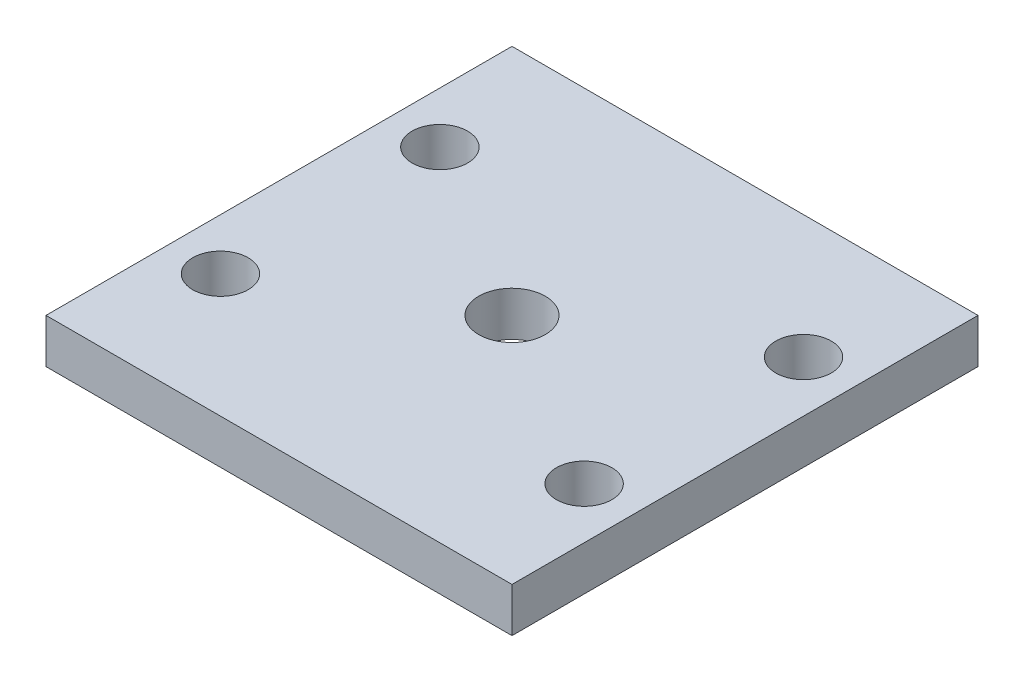
ISO-10303-21;
HEADER;
FILE_DESCRIPTION(('STEP AP214'),'2;1');
FILE_NAME('part.step','',(''),(''),'','','');
FILE_SCHEMA(('AUTOMOTIVE_DESIGN { 1 0 10303 214 1 1 1 1 }'));
ENDSEC;
DATA;
#1=APPLICATION_CONTEXT('core data for automotive mechanical design processes');
#2=APPLICATION_PROTOCOL_DEFINITION('international standard','automotive_design',2000,#1);
#3=PRODUCT_CONTEXT('',#1,'mechanical');
#4=PRODUCT('Part','Part','',(#3));
#5=PRODUCT_RELATED_PRODUCT_CATEGORY('part','',(#4));
#6=PRODUCT_DEFINITION_FORMATION('','',#4);
#7=PRODUCT_DEFINITION_CONTEXT('part definition',#1,'design');
#8=PRODUCT_DEFINITION('design','',#6,#7);
#9=PRODUCT_DEFINITION_SHAPE('','',#8);
#10=(LENGTH_UNIT() NAMED_UNIT(*) SI_UNIT(.MILLI.,.METRE.));
#11=(NAMED_UNIT(*) PLANE_ANGLE_UNIT() SI_UNIT($,.RADIAN.));
#12=(NAMED_UNIT(*) SI_UNIT($,.STERADIAN.) SOLID_ANGLE_UNIT());
#13=UNCERTAINTY_MEASURE_WITH_UNIT(LENGTH_MEASURE(1.E-05),#10,'distance_accuracy_value','');
#14=(GEOMETRIC_REPRESENTATION_CONTEXT(3) GLOBAL_UNCERTAINTY_ASSIGNED_CONTEXT((#13)) GLOBAL_UNIT_ASSIGNED_CONTEXT((#10,
#11,#12)) REPRESENTATION_CONTEXT('',''));
#15=CARTESIAN_POINT('',(0.,0.,0.));
#16=DIRECTION('',(0.,0.,1.));
#17=DIRECTION('',(1.,0.,0.));
#18=AXIS2_PLACEMENT_3D('',#15,#16,#17);
#19=CARTESIAN_POINT('',(22.2768689310223,4.,-20.3615655344889));
#20=DIRECTION('',(-1.,0.,0.));
#21=DIRECTION('',(0.,0.,1.));
#22=AXIS2_PLACEMENT_3D('',#19,#20,#21);
#23=PLANE('',#22);
#24=DIRECTION('',(0.,0.,-1.));
#25=VECTOR('',#24,1.);
#26=CARTESIAN_POINT('',(22.2768689310223,0.,-20.3615655344889));
#27=LINE('',#26,#25);
#28=CARTESIAN_POINT('',(22.2768689310223,0.,21.6384344655111));
#29=VERTEX_POINT('',#28);
#30=CARTESIAN_POINT('',(22.2768689310223,0.,-20.3615655344889));
#31=VERTEX_POINT('',#30);
#32=EDGE_CURVE('E99',#29,#31,#27,.T.);
#33=ORIENTED_EDGE('',*,*,#32,.T.);
#34=DIRECTION('',(0.,-1.,0.));
#35=VECTOR('',#34,1.);
#36=CARTESIAN_POINT('',(22.2768689310223,4.,-20.3615655344889));
#37=LINE('',#36,#35);
#38=CARTESIAN_POINT('',(22.2768689310223,4.,-20.3615655344889));
#39=VERTEX_POINT('',#38);
#40=EDGE_CURVE('E11',#39,#31,#37,.T.);
#41=ORIENTED_EDGE('',*,*,#40,.F.);
#42=DIRECTION('',(0.,0.,-1.));
#43=VECTOR('',#42,1.);
#44=CARTESIAN_POINT('',(22.2768689310223,4.,-20.3615655344889));
#45=LINE('',#44,#43);
#46=CARTESIAN_POINT('',(22.2768689310223,4.,21.6384344655111));
#47=VERTEX_POINT('',#46);
#48=EDGE_CURVE('E86',#47,#39,#45,.T.);
#49=ORIENTED_EDGE('',*,*,#48,.F.);
#50=DIRECTION('',(0.,-1.,0.));
#51=VECTOR('',#50,1.);
#52=CARTESIAN_POINT('',(22.2768689310223,4.,21.6384344655111));
#53=LINE('',#52,#51);
#54=EDGE_CURVE('E95',#47,#29,#53,.T.);
#55=ORIENTED_EDGE('',*,*,#54,.T.);
#56=EDGE_LOOP('',(#33,#41,#49,#55));
#57=FACE_BOUND('',#56,.T.);
#58=ADVANCED_FACE('F33',(#57),#23,.F.);
#59=CARTESIAN_POINT('',(-19.7231310689777,4.,-20.3615655344889));
#60=DIRECTION('',(0.,0.,1.));
#61=DIRECTION('',(1.,0.,0.));
#62=AXIS2_PLACEMENT_3D('',#59,#60,#61);
#63=PLANE('',#62);
#64=DIRECTION('',(-1.,0.,0.));
#65=VECTOR('',#64,1.);
#66=CARTESIAN_POINT('',(-19.7231310689777,0.,-20.3615655344889));
#67=LINE('',#66,#65);
#68=CARTESIAN_POINT('',(-19.7231310689777,0.,-20.3615655344889));
#69=VERTEX_POINT('',#68);
#70=EDGE_CURVE('E90',#31,#69,#67,.T.);
#71=ORIENTED_EDGE('',*,*,#70,.T.);
#72=DIRECTION('',(0.,-1.,0.));
#73=VECTOR('',#72,1.);
#74=CARTESIAN_POINT('',(-19.7231310689777,4.,-20.3615655344889));
#75=LINE('',#74,#73);
#76=CARTESIAN_POINT('',(-19.7231310689777,4.,-20.3615655344889));
#77=VERTEX_POINT('',#76);
#78=EDGE_CURVE('E42',#77,#69,#75,.T.);
#79=ORIENTED_EDGE('',*,*,#78,.F.);
#80=DIRECTION('',(-1.,0.,0.));
#81=VECTOR('',#80,1.);
#82=CARTESIAN_POINT('',(-19.7231310689777,4.,-20.3615655344889));
#83=LINE('',#82,#81);
#84=EDGE_CURVE('E81',#39,#77,#83,.T.);
#85=ORIENTED_EDGE('',*,*,#84,.F.);
#86=ORIENTED_EDGE('',*,*,#40,.T.);
#87=EDGE_LOOP('',(#71,#79,#85,#86));
#88=FACE_BOUND('',#87,.T.);
#89=ADVANCED_FACE('F89',(#88),#63,.F.);
#90=CARTESIAN_POINT('',(-19.7231310689777,4.,-20.3615655344889));
#91=DIRECTION('',(1.,0.,0.));
#92=DIRECTION('',(0.,0.,-1.));
#93=AXIS2_PLACEMENT_3D('',#90,#91,#92);
#94=PLANE('',#93);
#95=DIRECTION('',(0.,0.,1.));
#96=VECTOR('',#95,1.);
#97=CARTESIAN_POINT('',(-19.7231310689777,0.,-20.3615655344889));
#98=LINE('',#97,#96);
#99=CARTESIAN_POINT('',(-19.7231310689777,0.,21.6384344655112));
#100=VERTEX_POINT('',#99);
#101=EDGE_CURVE('E68',#69,#100,#98,.T.);
#102=ORIENTED_EDGE('',*,*,#101,.T.);
#103=DIRECTION('',(0.,-1.,0.));
#104=VECTOR('',#103,1.);
#105=CARTESIAN_POINT('',(-19.7231310689777,4.,21.6384344655112));
#106=LINE('',#105,#104);
#107=CARTESIAN_POINT('',(-19.7231310689777,4.,21.6384344655112));
#108=VERTEX_POINT('',#107);
#109=EDGE_CURVE('E91',#108,#100,#106,.T.);
#110=ORIENTED_EDGE('',*,*,#109,.F.);
#111=DIRECTION('',(0.,0.,1.));
#112=VECTOR('',#111,1.);
#113=CARTESIAN_POINT('',(-19.7231310689777,4.,-20.3615655344889));
#114=LINE('',#113,#112);
#115=EDGE_CURVE('E84',#77,#108,#114,.T.);
#116=ORIENTED_EDGE('',*,*,#115,.F.);
#117=ORIENTED_EDGE('',*,*,#78,.T.);
#118=EDGE_LOOP('',(#102,#110,#116,#117));
#119=FACE_BOUND('',#118,.T.);
#120=ADVANCED_FACE('F93',(#119),#94,.F.);
#121=CARTESIAN_POINT('',(-19.7231310689777,4.,21.6384344655112));
#122=DIRECTION('',(0.,0.,-1.));
#123=DIRECTION('',(-1.,0.,0.));
#124=AXIS2_PLACEMENT_3D('',#121,#122,#123);
#125=PLANE('',#124);
#126=DIRECTION('',(1.,0.,0.));
#127=VECTOR('',#126,1.);
#128=CARTESIAN_POINT('',(-19.7231310689777,0.,21.6384344655112));
#129=LINE('',#128,#127);
#130=EDGE_CURVE('E74',#100,#29,#129,.T.);
#131=ORIENTED_EDGE('',*,*,#130,.T.);
#132=ORIENTED_EDGE('',*,*,#54,.F.);
#133=DIRECTION('',(1.,0.,0.));
#134=VECTOR('',#133,1.);
#135=CARTESIAN_POINT('',(-19.7231310689777,4.,21.6384344655112));
#136=LINE('',#135,#134);
#137=EDGE_CURVE('E51',#108,#47,#136,.T.);
#138=ORIENTED_EDGE('',*,*,#137,.F.);
#139=ORIENTED_EDGE('',*,*,#109,.T.);
#140=EDGE_LOOP('',(#131,#132,#138,#139));
#141=FACE_BOUND('',#140,.T.);
#142=ADVANCED_FACE('F144',(#141),#125,.F.);
#143=CARTESIAN_POINT('',(0.,4.,0.));
#144=DIRECTION('',(0.,1.,0.));
#145=DIRECTION('',(0.,0.,1.));
#146=AXIS2_PLACEMENT_3D('',#143,#144,#145);
#147=PLANE('',#146);
#148=CARTESIAN_POINT('',(-15.1119539313528,4.,10.5254030142186));
#149=DIRECTION('',(0.,1.,0.));
#150=DIRECTION('',(0.,0.,1.));
#151=AXIS2_PLACEMENT_3D('',#148,#149,#150);
#152=CIRCLE('',#151,2.5);
#153=CARTESIAN_POINT('',(-15.1119539313528,4.,13.0254030142186));
#154=VERTEX_POINT('',#153);
#155=EDGE_CURVE('E134',#154,#154,#152,.T.);
#156=ORIENTED_EDGE('',*,*,#155,.F.);
#157=EDGE_LOOP('',(#156));
#158=FACE_BOUND('',#157,.T.);
#159=CARTESIAN_POINT('',(-15.1119539313528,4.,-9.24853408319629));
#160=DIRECTION('',(0.,1.,0.));
#161=DIRECTION('',(0.,0.,1.));
#162=AXIS2_PLACEMENT_3D('',#159,#160,#161);
#163=CIRCLE('',#162,2.5);
#164=CARTESIAN_POINT('',(-15.1119539313528,4.,-6.74853408319629));
#165=VERTEX_POINT('',#164);
#166=EDGE_CURVE('E128',#165,#165,#163,.T.);
#167=ORIENTED_EDGE('',*,*,#166,.F.);
#168=EDGE_LOOP('',(#167));
#169=FACE_BOUND('',#168,.T.);
#170=CARTESIAN_POINT('',(17.6656917933974,4.,-9.24853408319629));
#171=DIRECTION('',(0.,1.,0.));
#172=DIRECTION('',(0.,0.,1.));
#173=AXIS2_PLACEMENT_3D('',#170,#171,#172);
#174=CIRCLE('',#173,2.5);
#175=CARTESIAN_POINT('',(17.6656917933974,4.,-6.74853408319629));
#176=VERTEX_POINT('',#175);
#177=EDGE_CURVE('E125',#176,#176,#174,.T.);
#178=ORIENTED_EDGE('',*,*,#177,.F.);
#179=EDGE_LOOP('',(#178));
#180=FACE_BOUND('',#179,.T.);
#181=CARTESIAN_POINT('',(17.6656917933974,4.,10.5254030142186));
#182=DIRECTION('',(0.,1.,0.));
#183=DIRECTION('',(0.,0.,1.));
#184=AXIS2_PLACEMENT_3D('',#181,#182,#183);
#185=CIRCLE('',#184,2.5);
#186=CARTESIAN_POINT('',(17.6656917933974,4.,13.0254030142186));
#187=VERTEX_POINT('',#186);
#188=EDGE_CURVE('E117',#187,#187,#185,.T.);
#189=ORIENTED_EDGE('',*,*,#188,.F.);
#190=EDGE_LOOP('',(#189));
#191=FACE_BOUND('',#190,.T.);
#192=CARTESIAN_POINT('',(1.2768689310223,4.,0.63843446551114));
#193=DIRECTION('',(0.,1.,0.));
#194=DIRECTION('',(0.,0.,1.));
#195=AXIS2_PLACEMENT_3D('',#192,#193,#194);
#196=CIRCLE('',#195,3.);
#197=CARTESIAN_POINT('',(1.2768689310223,4.,3.63843446551114));
#198=VERTEX_POINT('',#197);
#199=EDGE_CURVE('E108',#198,#198,#196,.T.);
#200=ORIENTED_EDGE('',*,*,#199,.F.);
#201=EDGE_LOOP('',(#200));
#202=FACE_BOUND('',#201,.T.);
#203=ORIENTED_EDGE('',*,*,#48,.T.);
#204=ORIENTED_EDGE('',*,*,#84,.T.);
#205=ORIENTED_EDGE('',*,*,#115,.T.);
#206=ORIENTED_EDGE('',*,*,#137,.T.);
#207=EDGE_LOOP('',(#203,#204,#205,#206));
#208=FACE_BOUND('',#207,.T.);
#209=ADVANCED_FACE('F82',(#158,#169,#180,#191,#202,#208),#147,.T.);
#210=CARTESIAN_POINT('',(0.,0.,0.));
#211=DIRECTION('',(0.,1.,0.));
#212=DIRECTION('',(0.,0.,1.));
#213=AXIS2_PLACEMENT_3D('',#210,#211,#212);
#214=PLANE('',#213);
#215=CARTESIAN_POINT('',(-15.1119539313528,0.,10.5254030142186));
#216=DIRECTION('',(0.,1.,0.));
#217=DIRECTION('',(0.,0.,1.));
#218=AXIS2_PLACEMENT_3D('',#215,#216,#217);
#219=CIRCLE('',#218,2.5);
#220=CARTESIAN_POINT('',(-15.1119539313528,0.,13.0254030142186));
#221=VERTEX_POINT('',#220);
#222=EDGE_CURVE('E131',#221,#221,#219,.T.);
#223=ORIENTED_EDGE('',*,*,#222,.T.);
#224=EDGE_LOOP('',(#223));
#225=FACE_BOUND('',#224,.T.);
#226=CARTESIAN_POINT('',(-15.1119539313528,0.,-9.24853408319629));
#227=DIRECTION('',(0.,1.,0.));
#228=DIRECTION('',(0.,0.,1.));
#229=AXIS2_PLACEMENT_3D('',#226,#227,#228);
#230=CIRCLE('',#229,2.5);
#231=CARTESIAN_POINT('',(-15.1119539313528,0.,-6.74853408319629));
#232=VERTEX_POINT('',#231);
#233=EDGE_CURVE('E36',#232,#232,#230,.T.);
#234=ORIENTED_EDGE('',*,*,#233,.T.);
#235=EDGE_LOOP('',(#234));
#236=FACE_BOUND('',#235,.T.);
#237=CARTESIAN_POINT('',(17.6656917933974,0.,-9.24853408319629));
#238=DIRECTION('',(0.,1.,0.));
#239=DIRECTION('',(0.,0.,1.));
#240=AXIS2_PLACEMENT_3D('',#237,#238,#239);
#241=CIRCLE('',#240,2.5);
#242=CARTESIAN_POINT('',(17.6656917933974,0.,-6.74853408319629));
#243=VERTEX_POINT('',#242);
#244=EDGE_CURVE('E122',#243,#243,#241,.T.);
#245=ORIENTED_EDGE('',*,*,#244,.T.);
#246=EDGE_LOOP('',(#245));
#247=FACE_BOUND('',#246,.T.);
#248=CARTESIAN_POINT('',(17.6656917933974,0.,10.5254030142186));
#249=DIRECTION('',(0.,1.,0.));
#250=DIRECTION('',(0.,0.,1.));
#251=AXIS2_PLACEMENT_3D('',#248,#249,#250);
#252=CIRCLE('',#251,2.5);
#253=CARTESIAN_POINT('',(17.6656917933974,0.,13.0254030142186));
#254=VERTEX_POINT('',#253);
#255=EDGE_CURVE('E112',#254,#254,#252,.T.);
#256=ORIENTED_EDGE('',*,*,#255,.T.);
#257=EDGE_LOOP('',(#256));
#258=FACE_BOUND('',#257,.T.);
#259=CARTESIAN_POINT('',(1.2768689310223,0.,0.63843446551114));
#260=DIRECTION('',(0.,1.,0.));
#261=DIRECTION('',(0.,0.,1.));
#262=AXIS2_PLACEMENT_3D('',#259,#260,#261);
#263=CIRCLE('',#262,3.);
#264=CARTESIAN_POINT('',(1.2768689310223,0.,3.63843446551114));
#265=VERTEX_POINT('',#264);
#266=EDGE_CURVE('E102',#265,#265,#263,.T.);
#267=ORIENTED_EDGE('',*,*,#266,.T.);
#268=EDGE_LOOP('',(#267));
#269=FACE_BOUND('',#268,.T.);
#270=ORIENTED_EDGE('',*,*,#32,.F.);
#271=ORIENTED_EDGE('',*,*,#130,.F.);
#272=ORIENTED_EDGE('',*,*,#101,.F.);
#273=ORIENTED_EDGE('',*,*,#70,.F.);
#274=EDGE_LOOP('',(#270,#271,#272,#273));
#275=FACE_BOUND('',#274,.T.);
#276=ADVANCED_FACE('F143',(#225,#236,#247,#258,#269,#275),#214,.F.);
#277=CARTESIAN_POINT('',(1.2768689310223,-12.,0.63843446551114));
#278=DIRECTION('',(0.,1.,0.));
#279=DIRECTION('',(0.,0.,1.));
#280=AXIS2_PLACEMENT_3D('',#277,#278,#279);
#281=CYLINDRICAL_SURFACE('',#280,3.);
#282=ORIENTED_EDGE('',*,*,#199,.T.);
#283=EDGE_LOOP('',(#282));
#284=FACE_BOUND('',#283,.T.);
#285=ORIENTED_EDGE('',*,*,#266,.F.);
#286=EDGE_LOOP('',(#285));
#287=FACE_BOUND('',#286,.T.);
#288=ADVANCED_FACE('F157',(#284,#287),#281,.F.);
#289=CARTESIAN_POINT('',(17.6656917933974,4.,10.5254030142186));
#290=DIRECTION('',(0.,1.,0.));
#291=DIRECTION('',(0.,0.,1.));
#292=AXIS2_PLACEMENT_3D('',#289,#290,#291);
#293=CYLINDRICAL_SURFACE('',#292,2.5);
#294=ORIENTED_EDGE('',*,*,#188,.T.);
#295=EDGE_LOOP('',(#294));
#296=FACE_BOUND('',#295,.T.);
#297=ORIENTED_EDGE('',*,*,#255,.F.);
#298=EDGE_LOOP('',(#297));
#299=FACE_BOUND('',#298,.T.);
#300=ADVANCED_FACE('F153',(#296,#299),#293,.F.);
#301=CARTESIAN_POINT('',(17.6656917933974,4.,-9.24853408319629));
#302=DIRECTION('',(0.,1.,0.));
#303=DIRECTION('',(0.,0.,1.));
#304=AXIS2_PLACEMENT_3D('',#301,#302,#303);
#305=CYLINDRICAL_SURFACE('',#304,2.5);
#306=ORIENTED_EDGE('',*,*,#177,.T.);
#307=EDGE_LOOP('',(#306));
#308=FACE_BOUND('',#307,.T.);
#309=ORIENTED_EDGE('',*,*,#244,.F.);
#310=EDGE_LOOP('',(#309));
#311=FACE_BOUND('',#310,.T.);
#312=ADVANCED_FACE('F156',(#308,#311),#305,.F.);
#313=CARTESIAN_POINT('',(-15.1119539313528,4.,-9.24853408319629));
#314=DIRECTION('',(0.,1.,0.));
#315=DIRECTION('',(0.,0.,1.));
#316=AXIS2_PLACEMENT_3D('',#313,#314,#315);
#317=CYLINDRICAL_SURFACE('',#316,2.5);
#318=ORIENTED_EDGE('',*,*,#166,.T.);
#319=EDGE_LOOP('',(#318));
#320=FACE_BOUND('',#319,.T.);
#321=ORIENTED_EDGE('',*,*,#233,.F.);
#322=EDGE_LOOP('',(#321));
#323=FACE_BOUND('',#322,.T.);
#324=ADVANCED_FACE('F222',(#320,#323),#317,.F.);
#325=CARTESIAN_POINT('',(-15.1119539313528,4.,10.5254030142186));
#326=DIRECTION('',(0.,1.,0.));
#327=DIRECTION('',(0.,0.,1.));
#328=AXIS2_PLACEMENT_3D('',#325,#326,#327);
#329=CYLINDRICAL_SURFACE('',#328,2.5);
#330=ORIENTED_EDGE('',*,*,#155,.T.);
#331=EDGE_LOOP('',(#330));
#332=FACE_BOUND('',#331,.T.);
#333=ORIENTED_EDGE('',*,*,#222,.F.);
#334=EDGE_LOOP('',(#333));
#335=FACE_BOUND('',#334,.T.);
#336=ADVANCED_FACE('F138',(#332,#335),#329,.F.);
#337=CLOSED_SHELL('',(#58,#89,#120,#142,#209,#276,#288,#300,#312,#324,#336));
#338=MANIFOLD_SOLID_BREP('B2',#337);
#339=ADVANCED_BREP_SHAPE_REPRESENTATION('',(#18,#338),#14);
#340=SHAPE_DEFINITION_REPRESENTATION(#9,#339);
ENDSEC;
END-ISO-10303-21;
